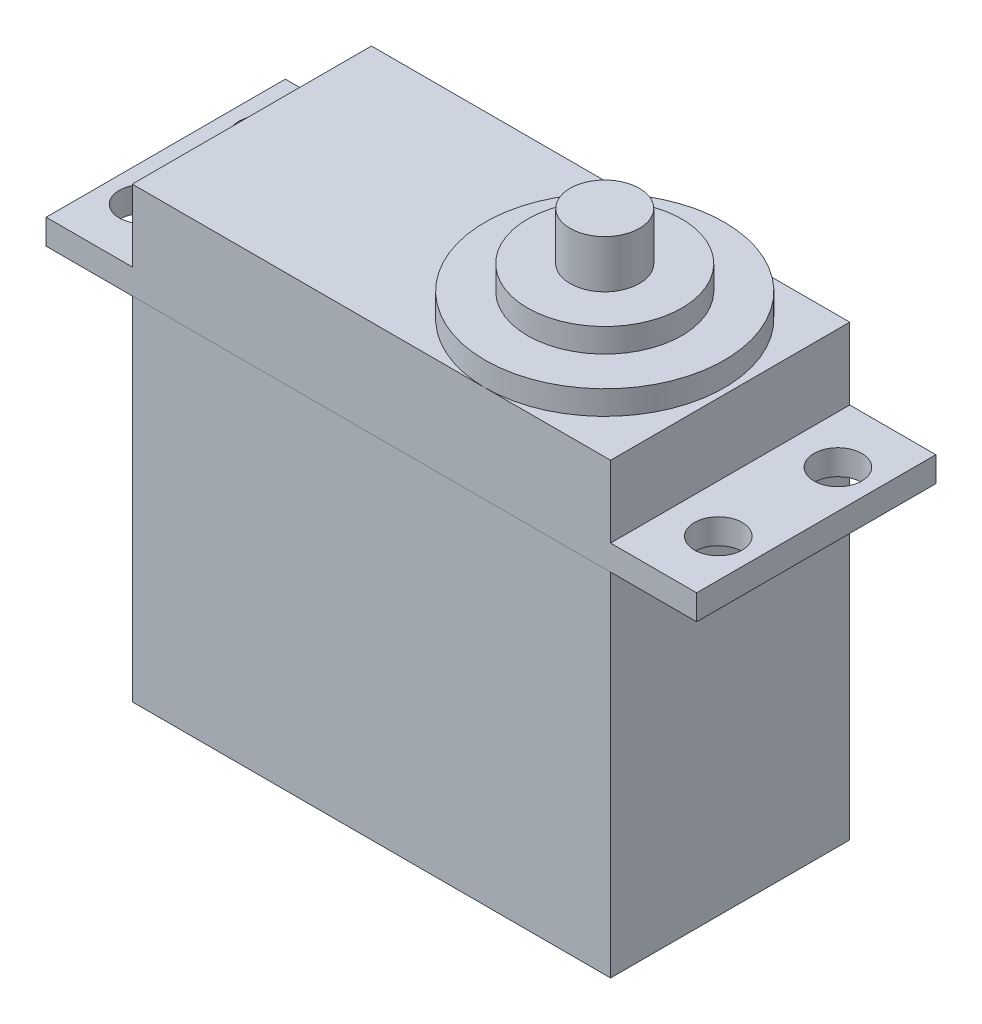
ISO-10303-21;
HEADER;
FILE_DESCRIPTION(('STEP AP214'),'2;1');
FILE_NAME('part.step','',(''),(''),'','','');
FILE_SCHEMA(('AUTOMOTIVE_DESIGN { 1 0 10303 214 1 1 1 1 }'));
ENDSEC;
DATA;
#1=APPLICATION_CONTEXT('core data for automotive mechanical design processes');
#2=APPLICATION_PROTOCOL_DEFINITION('international standard','automotive_design',2000,#1);
#3=PRODUCT_CONTEXT('',#1,'mechanical');
#4=PRODUCT('Part','Part','',(#3));
#5=PRODUCT_RELATED_PRODUCT_CATEGORY('part','',(#4));
#6=PRODUCT_DEFINITION_FORMATION('','',#4);
#7=PRODUCT_DEFINITION_CONTEXT('part definition',#1,'design');
#8=PRODUCT_DEFINITION('design','',#6,#7);
#9=PRODUCT_DEFINITION_SHAPE('','',#8);
#10=(LENGTH_UNIT() NAMED_UNIT(*) SI_UNIT(.MILLI.,.METRE.));
#11=(NAMED_UNIT(*) PLANE_ANGLE_UNIT() SI_UNIT($,.RADIAN.));
#12=(NAMED_UNIT(*) SI_UNIT($,.STERADIAN.) SOLID_ANGLE_UNIT());
#13=UNCERTAINTY_MEASURE_WITH_UNIT(LENGTH_MEASURE(1.E-05),#10,'distance_accuracy_value','');
#14=(GEOMETRIC_REPRESENTATION_CONTEXT(3) GLOBAL_UNCERTAINTY_ASSIGNED_CONTEXT((#13)) GLOBAL_UNIT_ASSIGNED_CONTEXT((#10,
#11,#12)) REPRESENTATION_CONTEXT('',''));
#15=CARTESIAN_POINT('',(0.,0.,0.));
#16=DIRECTION('',(0.,0.,1.));
#17=DIRECTION('',(1.,0.,0.));
#18=AXIS2_PLACEMENT_3D('',#15,#16,#17);
#19=CARTESIAN_POINT('',(0.,37.5,0.));
#20=DIRECTION('',(0.,1.,0.));
#21=DIRECTION('',(0.,0.,1.));
#22=AXIS2_PLACEMENT_3D('',#19,#20,#21);
#23=PLANE('',#22);
#24=CARTESIAN_POINT('',(29.5103682892478,37.5,10.001656383287));
#25=DIRECTION('',(0.,1.,0.));
#26=DIRECTION('',(0.,0.,1.));
#27=AXIS2_PLACEMENT_3D('',#24,#25,#26);
#28=CIRCLE('',#27,10.001656383287);
#29=CARTESIAN_POINT('',(29.5103682892478,37.5,20.0033127665741));
#30=VERTEX_POINT('',#29);
#31=CARTESIAN_POINT('',(29.5103682892478,37.5,0.));
#32=VERTEX_POINT('',#31);
#33=EDGE_CURVE('E49',#30,#32,#28,.T.);
#34=ORIENTED_EDGE('',*,*,#33,.F.);
#35=DIRECTION('',(1.,0.,0.));
#36=VECTOR('',#35,1.);
#37=CARTESIAN_POINT('',(0.,37.5,20.0033127665741));
#38=LINE('',#37,#36);
#39=CARTESIAN_POINT('',(40.0016265814225,37.5,20.0033127665741));
#40=VERTEX_POINT('',#39);
#41=EDGE_CURVE('E141',#30,#40,#38,.T.);
#42=ORIENTED_EDGE('',*,*,#41,.T.);
#43=DIRECTION('',(-8.13156018770147E-05,0.,-0.999999996693887));
#44=VECTOR('',#43,1.);
#45=CARTESIAN_POINT('',(40.0016265814225,37.5,20.0033127665741));
#46=LINE('',#45,#44);
#47=CARTESIAN_POINT('',(40.,37.5,0.));
#48=VERTEX_POINT('',#47);
#49=EDGE_CURVE('E140',#40,#48,#46,.T.);
#50=ORIENTED_EDGE('',*,*,#49,.T.);
#51=DIRECTION('',(-1.,0.,0.));
#52=VECTOR('',#51,1.);
#53=CARTESIAN_POINT('',(40.,37.5,0.));
#54=LINE('',#53,#52);
#55=EDGE_CURVE('E153',#48,#32,#54,.T.);
#56=ORIENTED_EDGE('',*,*,#55,.T.);
#57=EDGE_LOOP('',(#34,#42,#50,#56));
#58=FACE_BOUND('',#57,.T.);
#59=ADVANCED_FACE('F38',(#58),#23,.T.);
#60=CARTESIAN_POINT('',(0.,31.5,0.));
#61=DIRECTION('',(0.,1.,0.));
#62=DIRECTION('',(0.,0.,1.));
#63=AXIS2_PLACEMENT_3D('',#60,#61,#62);
#64=PLANE('',#63);
#65=DIRECTION('',(-8.13156018770147E-05,0.,-0.999999996693887));
#66=VECTOR('',#65,1.);
#67=CARTESIAN_POINT('',(40.0016265814225,31.5,20.0033127665741));
#68=LINE('',#67,#66);
#69=CARTESIAN_POINT('',(40.0016265814225,31.5,20.0033127665741));
#70=VERTEX_POINT('',#69);
#71=CARTESIAN_POINT('',(40.,31.5,0.));
#72=VERTEX_POINT('',#71);
#73=EDGE_CURVE('E62',#70,#72,#68,.T.);
#74=ORIENTED_EDGE('',*,*,#73,.F.);
#75=DIRECTION('',(1.,0.,0.));
#76=VECTOR('',#75,1.);
#77=CARTESIAN_POINT('',(-7.19999999999999,31.5,20.0033127665741));
#78=LINE('',#77,#76);
#79=CARTESIAN_POINT('',(47.2,31.5,20.0033127665741));
#80=VERTEX_POINT('',#79);
#81=EDGE_CURVE('E322',#70,#80,#78,.T.);
#82=ORIENTED_EDGE('',*,*,#81,.T.);
#83=DIRECTION('',(0.,0.,-1.));
#84=VECTOR('',#83,1.);
#85=CARTESIAN_POINT('',(47.2,31.5,20.0033127665741));
#86=LINE('',#85,#84);
#87=CARTESIAN_POINT('',(47.2,31.5,0.));
#88=VERTEX_POINT('',#87);
#89=EDGE_CURVE('E295',#80,#88,#86,.T.);
#90=ORIENTED_EDGE('',*,*,#89,.T.);
#91=DIRECTION('',(-1.,0.,0.));
#92=VECTOR('',#91,1.);
#93=CARTESIAN_POINT('',(20.,31.5,0.));
#94=LINE('',#93,#92);
#95=EDGE_CURVE('E317',#88,#72,#94,.T.);
#96=ORIENTED_EDGE('',*,*,#95,.T.);
#97=EDGE_LOOP('',(#74,#82,#90,#96));
#98=FACE_BOUND('',#97,.T.);
#99=CARTESIAN_POINT('',(44.0104813759934,31.5,5.00082819164352));
#100=DIRECTION('',(0.,1.,0.));
#101=DIRECTION('',(0.,0.,1.));
#102=AXIS2_PLACEMENT_3D('',#99,#100,#101);
#103=CIRCLE('',#102,2.);
#104=CARTESIAN_POINT('',(44.0104813759934,31.5,7.00082819164352));
#105=VERTEX_POINT('',#104);
#106=EDGE_CURVE('E364',#105,#105,#103,.T.);
#107=ORIENTED_EDGE('',*,*,#106,.F.);
#108=EDGE_LOOP('',(#107));
#109=FACE_BOUND('',#108,.T.);
#110=CARTESIAN_POINT('',(44.0104813759934,31.5,15.0024845749306));
#111=DIRECTION('',(0.,1.,0.));
#112=DIRECTION('',(0.,0.,1.));
#113=AXIS2_PLACEMENT_3D('',#110,#111,#112);
#114=CIRCLE('',#113,2.);
#115=CARTESIAN_POINT('',(44.0104813759934,31.5,17.0024845749306));
#116=VERTEX_POINT('',#115);
#117=EDGE_CURVE('E365',#116,#116,#114,.T.);
#118=ORIENTED_EDGE('',*,*,#117,.F.);
#119=EDGE_LOOP('',(#118));
#120=FACE_BOUND('',#119,.T.);
#121=ADVANCED_FACE('F173',(#98,#109,#120),#64,.T.);
#122=CARTESIAN_POINT('',(0.,29.4,0.));
#123=DIRECTION('',(1.,0.,0.));
#124=DIRECTION('',(0.,0.,-1.));
#125=AXIS2_PLACEMENT_3D('',#122,#123,#124);
#126=PLANE('',#125);
#127=DIRECTION('',(0.,0.,1.));
#128=VECTOR('',#127,1.);
#129=CARTESIAN_POINT('',(0.,0.,0.));
#130=LINE('',#129,#128);
#131=CARTESIAN_POINT('',(0.,0.,0.));
#132=VERTEX_POINT('',#131);
#133=CARTESIAN_POINT('',(0.,0.,20.));
#134=VERTEX_POINT('',#133);
#135=EDGE_CURVE('E247',#132,#134,#130,.T.);
#136=ORIENTED_EDGE('',*,*,#135,.T.);
#137=DIRECTION('',(0.,-1.,0.));
#138=VECTOR('',#137,1.);
#139=CARTESIAN_POINT('',(0.,29.4,20.));
#140=LINE('',#139,#138);
#141=CARTESIAN_POINT('',(0.,29.4,20.));
#142=VERTEX_POINT('',#141);
#143=EDGE_CURVE('E47',#142,#134,#140,.T.);
#144=ORIENTED_EDGE('',*,*,#143,.F.);
#145=DIRECTION('',(0.,0.,1.));
#146=VECTOR('',#145,1.);
#147=CARTESIAN_POINT('',(0.,29.4,0.));
#148=LINE('',#147,#146);
#149=CARTESIAN_POINT('',(0.,29.4,0.));
#150=VERTEX_POINT('',#149);
#151=EDGE_CURVE('E258',#150,#142,#148,.T.);
#152=ORIENTED_EDGE('',*,*,#151,.F.);
#153=DIRECTION('',(0.,-1.,0.));
#154=VECTOR('',#153,1.);
#155=CARTESIAN_POINT('',(0.,29.4,0.));
#156=LINE('',#155,#154);
#157=EDGE_CURVE('E264',#150,#132,#156,.T.);
#158=ORIENTED_EDGE('',*,*,#157,.T.);
#159=EDGE_LOOP('',(#136,#144,#152,#158));
#160=FACE_BOUND('',#159,.T.);
#161=ADVANCED_FACE('F40',(#160),#126,.F.);
#162=CARTESIAN_POINT('',(0.,29.4,20.));
#163=DIRECTION('',(0.,0.,-1.));
#164=DIRECTION('',(-1.,0.,0.));
#165=AXIS2_PLACEMENT_3D('',#162,#163,#164);
#166=PLANE('',#165);
#167=DIRECTION('',(1.,0.,0.));
#168=VECTOR('',#167,1.);
#169=CARTESIAN_POINT('',(0.,0.,20.));
#170=LINE('',#169,#168);
#171=CARTESIAN_POINT('',(40.,0.,20.));
#172=VERTEX_POINT('',#171);
#173=EDGE_CURVE('E238',#134,#172,#170,.T.);
#174=ORIENTED_EDGE('',*,*,#173,.T.);
#175=DIRECTION('',(0.,-1.,0.));
#176=VECTOR('',#175,1.);
#177=CARTESIAN_POINT('',(40.,29.4,20.));
#178=LINE('',#177,#176);
#179=CARTESIAN_POINT('',(40.,29.4,20.));
#180=VERTEX_POINT('',#179);
#181=EDGE_CURVE('E240',#180,#172,#178,.T.);
#182=ORIENTED_EDGE('',*,*,#181,.F.);
#183=DIRECTION('',(1.,0.,0.));
#184=VECTOR('',#183,1.);
#185=CARTESIAN_POINT('',(0.,29.4,20.));
#186=LINE('',#185,#184);
#187=EDGE_CURVE('E269',#142,#180,#186,.T.);
#188=ORIENTED_EDGE('',*,*,#187,.F.);
#189=ORIENTED_EDGE('',*,*,#143,.T.);
#190=EDGE_LOOP('',(#174,#182,#188,#189));
#191=FACE_BOUND('',#190,.T.);
#192=ADVANCED_FACE('F229',(#191),#166,.F.);
#193=CARTESIAN_POINT('',(40.,29.4,0.));
#194=DIRECTION('',(-1.,0.,0.));
#195=DIRECTION('',(0.,0.,1.));
#196=AXIS2_PLACEMENT_3D('',#193,#194,#195);
#197=PLANE('',#196);
#198=DIRECTION('',(0.,0.,-1.));
#199=VECTOR('',#198,1.);
#200=CARTESIAN_POINT('',(40.,0.,0.));
#201=LINE('',#200,#199);
#202=CARTESIAN_POINT('',(40.,0.,0.));
#203=VERTEX_POINT('',#202);
#204=EDGE_CURVE('E246',#172,#203,#201,.T.);
#205=ORIENTED_EDGE('',*,*,#204,.T.);
#206=DIRECTION('',(0.,-1.,0.));
#207=VECTOR('',#206,1.);
#208=CARTESIAN_POINT('',(40.,29.4,0.));
#209=LINE('',#208,#207);
#210=CARTESIAN_POINT('',(40.,29.4,0.));
#211=VERTEX_POINT('',#210);
#212=EDGE_CURVE('E253',#211,#203,#209,.T.);
#213=ORIENTED_EDGE('',*,*,#212,.F.);
#214=DIRECTION('',(0.,0.,-1.));
#215=VECTOR('',#214,1.);
#216=CARTESIAN_POINT('',(40.,29.4,0.));
#217=LINE('',#216,#215);
#218=EDGE_CURVE('E251',#180,#211,#217,.T.);
#219=ORIENTED_EDGE('',*,*,#218,.F.);
#220=ORIENTED_EDGE('',*,*,#181,.T.);
#221=EDGE_LOOP('',(#205,#213,#219,#220));
#222=FACE_BOUND('',#221,.T.);
#223=ADVANCED_FACE('F226',(#222),#197,.F.);
#224=CARTESIAN_POINT('',(0.,29.4,0.));
#225=DIRECTION('',(0.,0.,1.));
#226=DIRECTION('',(1.,0.,0.));
#227=AXIS2_PLACEMENT_3D('',#224,#225,#226);
#228=PLANE('',#227);
#229=DIRECTION('',(-1.,0.,0.));
#230=VECTOR('',#229,1.);
#231=CARTESIAN_POINT('',(0.,0.,0.));
#232=LINE('',#231,#230);
#233=EDGE_CURVE('E256',#203,#132,#232,.T.);
#234=ORIENTED_EDGE('',*,*,#233,.T.);
#235=ORIENTED_EDGE('',*,*,#157,.F.);
#236=DIRECTION('',(-1.,0.,0.));
#237=VECTOR('',#236,1.);
#238=CARTESIAN_POINT('',(20.,29.4,0.));
#239=LINE('',#238,#237);
#240=CARTESIAN_POINT('',(-7.19999999999999,29.4,0.));
#241=VERTEX_POINT('',#240);
#242=EDGE_CURVE('E291',#150,#241,#239,.T.);
#243=ORIENTED_EDGE('',*,*,#242,.T.);
#244=DIRECTION('',(0.,-1.,0.));
#245=VECTOR('',#244,1.);
#246=CARTESIAN_POINT('',(-7.19999999999999,31.5,0.));
#247=LINE('',#246,#245);
#248=CARTESIAN_POINT('',(-7.19999999999999,31.5,0.));
#249=VERTEX_POINT('',#248);
#250=EDGE_CURVE('E274',#249,#241,#247,.T.);
#251=ORIENTED_EDGE('',*,*,#250,.F.);
#252=CARTESIAN_POINT('',(0.,31.5,0.));
#253=VERTEX_POINT('',#252);
#254=EDGE_CURVE('E304',#253,#249,#94,.T.);
#255=ORIENTED_EDGE('',*,*,#254,.F.);
#256=DIRECTION('',(0.,-1.,0.));
#257=VECTOR('',#256,1.);
#258=CARTESIAN_POINT('',(0.,37.5,0.));
#259=LINE('',#258,#257);
#260=CARTESIAN_POINT('',(0.,37.5,0.));
#261=VERTEX_POINT('',#260);
#262=EDGE_CURVE('E344',#261,#253,#259,.T.);
#263=ORIENTED_EDGE('',*,*,#262,.F.);
#264=EDGE_CURVE('E352',#32,#261,#54,.T.);
#265=ORIENTED_EDGE('',*,*,#264,.F.);
#266=ORIENTED_EDGE('',*,*,#55,.F.);
#267=DIRECTION('',(0.,-1.,0.));
#268=VECTOR('',#267,1.);
#269=CARTESIAN_POINT('',(40.,37.5,0.));
#270=LINE('',#269,#268);
#271=EDGE_CURVE('E319',#48,#72,#270,.T.);
#272=ORIENTED_EDGE('',*,*,#271,.T.);
#273=ORIENTED_EDGE('',*,*,#95,.F.);
#274=DIRECTION('',(0.,-1.,0.));
#275=VECTOR('',#274,1.);
#276=CARTESIAN_POINT('',(47.2,31.5,0.));
#277=LINE('',#276,#275);
#278=CARTESIAN_POINT('',(47.2,29.4,0.));
#279=VERTEX_POINT('',#278);
#280=EDGE_CURVE('E305',#88,#279,#277,.T.);
#281=ORIENTED_EDGE('',*,*,#280,.T.);
#282=EDGE_CURVE('E287',#279,#211,#239,.T.);
#283=ORIENTED_EDGE('',*,*,#282,.T.);
#284=ORIENTED_EDGE('',*,*,#212,.T.);
#285=EDGE_LOOP('',(#234,#235,#243,#251,#255,#263,#265,#266,#272,#273,#281,#283,#284));
#286=FACE_BOUND('',#285,.T.);
#287=ADVANCED_FACE('F222',(#286),#228,.F.);
#288=CARTESIAN_POINT('',(0.,0.,0.));
#289=DIRECTION('',(0.,1.,0.));
#290=DIRECTION('',(0.,0.,1.));
#291=AXIS2_PLACEMENT_3D('',#288,#289,#290);
#292=PLANE('',#291);
#293=ORIENTED_EDGE('',*,*,#135,.F.);
#294=ORIENTED_EDGE('',*,*,#233,.F.);
#295=ORIENTED_EDGE('',*,*,#204,.F.);
#296=ORIENTED_EDGE('',*,*,#173,.F.);
#297=EDGE_LOOP('',(#293,#294,#295,#296));
#298=FACE_BOUND('',#297,.T.);
#299=ADVANCED_FACE('F210',(#298),#292,.F.);
#300=CARTESIAN_POINT('',(0.,29.4,0.));
#301=DIRECTION('',(0.,1.,0.));
#302=DIRECTION('',(0.,0.,1.));
#303=AXIS2_PLACEMENT_3D('',#300,#301,#302);
#304=PLANE('',#303);
#305=CARTESIAN_POINT('',(44.0104813759934,29.4,15.0024845749306));
#306=DIRECTION('',(0.,1.,0.));
#307=DIRECTION('',(0.,0.,1.));
#308=AXIS2_PLACEMENT_3D('',#305,#306,#307);
#309=CIRCLE('',#308,2.);
#310=CARTESIAN_POINT('',(44.0104813759934,29.4,17.0024845749306));
#311=VERTEX_POINT('',#310);
#312=EDGE_CURVE('E361',#311,#311,#309,.T.);
#313=ORIENTED_EDGE('',*,*,#312,.T.);
#314=EDGE_LOOP('',(#313));
#315=FACE_BOUND('',#314,.T.);
#316=CARTESIAN_POINT('',(44.0104813759934,29.4,5.00082819164352));
#317=DIRECTION('',(0.,1.,0.));
#318=DIRECTION('',(0.,0.,1.));
#319=AXIS2_PLACEMENT_3D('',#316,#317,#318);
#320=CIRCLE('',#319,2.);
#321=CARTESIAN_POINT('',(44.0104813759934,29.4,7.00082819164352));
#322=VERTEX_POINT('',#321);
#323=EDGE_CURVE('E368',#322,#322,#320,.T.);
#324=ORIENTED_EDGE('',*,*,#323,.T.);
#325=EDGE_LOOP('',(#324));
#326=FACE_BOUND('',#325,.T.);
#327=CARTESIAN_POINT('',(-4.09577615885656,29.4,15.0024845749306));
#328=DIRECTION('',(0.,1.,0.));
#329=DIRECTION('',(0.,0.,1.));
#330=AXIS2_PLACEMENT_3D('',#327,#328,#329);
#331=CIRCLE('',#330,2.);
#332=CARTESIAN_POINT('',(-4.09577615885656,29.4,17.0024845749306));
#333=VERTEX_POINT('',#332);
#334=EDGE_CURVE('E374',#333,#333,#331,.T.);
#335=ORIENTED_EDGE('',*,*,#334,.T.);
#336=EDGE_LOOP('',(#335));
#337=FACE_BOUND('',#336,.T.);
#338=CARTESIAN_POINT('',(-4.09577615885656,29.4,5.00082819164352));
#339=DIRECTION('',(0.,1.,0.));
#340=DIRECTION('',(0.,0.,1.));
#341=AXIS2_PLACEMENT_3D('',#338,#339,#340);
#342=CIRCLE('',#341,2.);
#343=CARTESIAN_POINT('',(-4.09577615885656,29.4,7.00082819164352));
#344=VERTEX_POINT('',#343);
#345=EDGE_CURVE('E378',#344,#344,#342,.T.);
#346=ORIENTED_EDGE('',*,*,#345,.T.);
#347=EDGE_LOOP('',(#346));
#348=FACE_BOUND('',#347,.T.);
#349=ORIENTED_EDGE('',*,*,#242,.F.);
#350=ORIENTED_EDGE('',*,*,#151,.T.);
#351=ORIENTED_EDGE('',*,*,#187,.T.);
#352=ORIENTED_EDGE('',*,*,#218,.T.);
#353=ORIENTED_EDGE('',*,*,#282,.F.);
#354=DIRECTION('',(0.,0.,-1.));
#355=VECTOR('',#354,1.);
#356=CARTESIAN_POINT('',(47.2,29.4,20.0033127665741));
#357=LINE('',#356,#355);
#358=CARTESIAN_POINT('',(47.2,29.4,20.0033127665741));
#359=VERTEX_POINT('',#358);
#360=EDGE_CURVE('E301',#359,#279,#357,.T.);
#361=ORIENTED_EDGE('',*,*,#360,.F.);
#362=DIRECTION('',(1.,0.,0.));
#363=VECTOR('',#362,1.);
#364=CARTESIAN_POINT('',(-7.19999999999999,29.4,20.0033127665741));
#365=LINE('',#364,#363);
#366=CARTESIAN_POINT('',(-7.19999999999999,29.4,20.0033127665741));
#367=VERTEX_POINT('',#366);
#368=EDGE_CURVE('E299',#367,#359,#365,.T.);
#369=ORIENTED_EDGE('',*,*,#368,.F.);
#370=DIRECTION('',(0.,0.,1.));
#371=VECTOR('',#370,1.);
#372=CARTESIAN_POINT('',(-7.19999999999999,29.4,0.));
#373=LINE('',#372,#371);
#374=EDGE_CURVE('E290',#241,#367,#373,.T.);
#375=ORIENTED_EDGE('',*,*,#374,.F.);
#376=EDGE_LOOP('',(#349,#350,#351,#352,#353,#361,#369,#375));
#377=FACE_BOUND('',#376,.T.);
#378=ADVANCED_FACE('F206',(#315,#326,#337,#348,#377),#304,.F.);
#379=CARTESIAN_POINT('',(-7.19999999999999,31.5,0.));
#380=DIRECTION('',(1.,0.,0.));
#381=DIRECTION('',(0.,0.,-1.));
#382=AXIS2_PLACEMENT_3D('',#379,#380,#381);
#383=PLANE('',#382);
#384=ORIENTED_EDGE('',*,*,#374,.T.);
#385=DIRECTION('',(0.,-1.,0.));
#386=VECTOR('',#385,1.);
#387=CARTESIAN_POINT('',(-7.19999999999999,31.5,20.0033127665741));
#388=LINE('',#387,#386);
#389=CARTESIAN_POINT('',(-7.19999999999999,31.5,20.0033127665741));
#390=VERTEX_POINT('',#389);
#391=EDGE_CURVE('E277',#390,#367,#388,.T.);
#392=ORIENTED_EDGE('',*,*,#391,.F.);
#393=DIRECTION('',(0.,0.,1.));
#394=VECTOR('',#393,1.);
#395=CARTESIAN_POINT('',(-7.19999999999999,31.5,0.));
#396=LINE('',#395,#394);
#397=EDGE_CURVE('E320',#249,#390,#396,.T.);
#398=ORIENTED_EDGE('',*,*,#397,.F.);
#399=ORIENTED_EDGE('',*,*,#250,.T.);
#400=EDGE_LOOP('',(#384,#392,#398,#399));
#401=FACE_BOUND('',#400,.T.);
#402=ADVANCED_FACE('F209',(#401),#383,.F.);
#403=CARTESIAN_POINT('',(-7.19999999999999,31.5,20.0033127665741));
#404=DIRECTION('',(0.,0.,-1.));
#405=DIRECTION('',(-1.,0.,0.));
#406=AXIS2_PLACEMENT_3D('',#403,#404,#405);
#407=PLANE('',#406);
#408=ORIENTED_EDGE('',*,*,#368,.T.);
#409=DIRECTION('',(0.,-1.,0.));
#410=VECTOR('',#409,1.);
#411=CARTESIAN_POINT('',(47.2,31.5,20.0033127665741));
#412=LINE('',#411,#410);
#413=EDGE_CURVE('E283',#80,#359,#412,.T.);
#414=ORIENTED_EDGE('',*,*,#413,.F.);
#415=ORIENTED_EDGE('',*,*,#81,.F.);
#416=DIRECTION('',(0.,-1.,0.));
#417=VECTOR('',#416,1.);
#418=CARTESIAN_POINT('',(40.0016265814225,37.5,20.0033127665741));
#419=LINE('',#418,#417);
#420=EDGE_CURVE('E147',#40,#70,#419,.T.);
#421=ORIENTED_EDGE('',*,*,#420,.F.);
#422=ORIENTED_EDGE('',*,*,#41,.F.);
#423=CARTESIAN_POINT('',(0.,37.5,20.0033127665741));
#424=VERTEX_POINT('',#423);
#425=EDGE_CURVE('E132',#424,#30,#38,.T.);
#426=ORIENTED_EDGE('',*,*,#425,.F.);
#427=DIRECTION('',(0.,-1.,0.));
#428=VECTOR('',#427,1.);
#429=CARTESIAN_POINT('',(0.,37.5,20.0033127665741));
#430=LINE('',#429,#428);
#431=CARTESIAN_POINT('',(0.,31.5,20.0033127665741));
#432=VERTEX_POINT('',#431);
#433=EDGE_CURVE('E343',#424,#432,#430,.T.);
#434=ORIENTED_EDGE('',*,*,#433,.T.);
#435=EDGE_CURVE('E339',#390,#432,#78,.T.);
#436=ORIENTED_EDGE('',*,*,#435,.F.);
#437=ORIENTED_EDGE('',*,*,#391,.T.);
#438=EDGE_LOOP('',(#408,#414,#415,#421,#422,#426,#434,#436,#437));
#439=FACE_BOUND('',#438,.T.);
#440=ADVANCED_FACE('F145',(#439),#407,.F.);
#441=CARTESIAN_POINT('',(47.2,31.5,20.0033127665741));
#442=DIRECTION('',(-1.,0.,0.));
#443=DIRECTION('',(0.,0.,1.));
#444=AXIS2_PLACEMENT_3D('',#441,#442,#443);
#445=PLANE('',#444);
#446=ORIENTED_EDGE('',*,*,#360,.T.);
#447=ORIENTED_EDGE('',*,*,#280,.F.);
#448=ORIENTED_EDGE('',*,*,#89,.F.);
#449=ORIENTED_EDGE('',*,*,#413,.T.);
#450=EDGE_LOOP('',(#446,#447,#448,#449));
#451=FACE_BOUND('',#450,.T.);
#452=ADVANCED_FACE('F204',(#451),#445,.F.);
#453=DIRECTION('',(0.,0.,1.));
#454=VECTOR('',#453,1.);
#455=CARTESIAN_POINT('',(0.,31.5,0.));
#456=LINE('',#455,#454);
#457=EDGE_CURVE('E353',#253,#432,#456,.T.);
#458=ORIENTED_EDGE('',*,*,#457,.F.);
#459=ORIENTED_EDGE('',*,*,#254,.T.);
#460=ORIENTED_EDGE('',*,*,#397,.T.);
#461=ORIENTED_EDGE('',*,*,#435,.T.);
#462=EDGE_LOOP('',(#458,#459,#460,#461));
#463=FACE_BOUND('',#462,.T.);
#464=CARTESIAN_POINT('',(-4.09577615885656,31.5,15.0024845749306));
#465=DIRECTION('',(0.,1.,0.));
#466=DIRECTION('',(0.,0.,1.));
#467=AXIS2_PLACEMENT_3D('',#464,#465,#466);
#468=CIRCLE('',#467,2.);
#469=CARTESIAN_POINT('',(-4.09577615885656,31.5,17.0024845749306));
#470=VERTEX_POINT('',#469);
#471=EDGE_CURVE('E371',#470,#470,#468,.T.);
#472=ORIENTED_EDGE('',*,*,#471,.F.);
#473=EDGE_LOOP('',(#472));
#474=FACE_BOUND('',#473,.T.);
#475=CARTESIAN_POINT('',(-4.09577615885656,31.5,5.00082819164352));
#476=DIRECTION('',(0.,1.,0.));
#477=DIRECTION('',(0.,0.,1.));
#478=AXIS2_PLACEMENT_3D('',#475,#476,#477);
#479=CIRCLE('',#478,2.);
#480=CARTESIAN_POINT('',(-4.09577615885656,31.5,7.00082819164352));
#481=VERTEX_POINT('',#480);
#482=EDGE_CURVE('E332',#481,#481,#479,.T.);
#483=ORIENTED_EDGE('',*,*,#482,.F.);
#484=EDGE_LOOP('',(#483));
#485=FACE_BOUND('',#484,.T.);
#486=ADVANCED_FACE('F178',(#463,#474,#485),#64,.T.);
#487=CARTESIAN_POINT('',(-4.09577615885656,29.4,5.00082819164352));
#488=DIRECTION('',(0.,1.,0.));
#489=DIRECTION('',(0.,0.,1.));
#490=AXIS2_PLACEMENT_3D('',#487,#488,#489);
#491=CYLINDRICAL_SURFACE('',#490,2.);
#492=ORIENTED_EDGE('',*,*,#345,.F.);
#493=EDGE_LOOP('',(#492));
#494=FACE_BOUND('',#493,.T.);
#495=ORIENTED_EDGE('',*,*,#482,.T.);
#496=EDGE_LOOP('',(#495));
#497=FACE_BOUND('',#496,.T.);
#498=ADVANCED_FACE('F198',(#494,#497),#491,.F.);
#499=CARTESIAN_POINT('',(-4.09577615885656,29.4,15.0024845749306));
#500=DIRECTION('',(0.,1.,0.));
#501=DIRECTION('',(0.,0.,1.));
#502=AXIS2_PLACEMENT_3D('',#499,#500,#501);
#503=CYLINDRICAL_SURFACE('',#502,2.);
#504=ORIENTED_EDGE('',*,*,#334,.F.);
#505=EDGE_LOOP('',(#504));
#506=FACE_BOUND('',#505,.T.);
#507=ORIENTED_EDGE('',*,*,#471,.T.);
#508=EDGE_LOOP('',(#507));
#509=FACE_BOUND('',#508,.T.);
#510=ADVANCED_FACE('F194',(#506,#509),#503,.F.);
#511=CARTESIAN_POINT('',(44.0104813759934,29.4,5.00082819164352));
#512=DIRECTION('',(0.,1.,0.));
#513=DIRECTION('',(0.,0.,1.));
#514=AXIS2_PLACEMENT_3D('',#511,#512,#513);
#515=CYLINDRICAL_SURFACE('',#514,2.);
#516=ORIENTED_EDGE('',*,*,#323,.F.);
#517=EDGE_LOOP('',(#516));
#518=FACE_BOUND('',#517,.T.);
#519=ORIENTED_EDGE('',*,*,#106,.T.);
#520=EDGE_LOOP('',(#519));
#521=FACE_BOUND('',#520,.T.);
#522=ADVANCED_FACE('F190',(#518,#521),#515,.F.);
#523=CARTESIAN_POINT('',(44.0104813759934,29.4,15.0024845749306));
#524=DIRECTION('',(0.,1.,0.));
#525=DIRECTION('',(0.,0.,1.));
#526=AXIS2_PLACEMENT_3D('',#523,#524,#525);
#527=CYLINDRICAL_SURFACE('',#526,2.);
#528=ORIENTED_EDGE('',*,*,#312,.F.);
#529=EDGE_LOOP('',(#528));
#530=FACE_BOUND('',#529,.T.);
#531=ORIENTED_EDGE('',*,*,#117,.T.);
#532=EDGE_LOOP('',(#531));
#533=FACE_BOUND('',#532,.T.);
#534=ADVANCED_FACE('F186',(#530,#533),#527,.F.);
#535=CARTESIAN_POINT('',(0.,37.5,0.));
#536=DIRECTION('',(1.,0.,0.));
#537=DIRECTION('',(0.,0.,-1.));
#538=AXIS2_PLACEMENT_3D('',#535,#536,#537);
#539=PLANE('',#538);
#540=ORIENTED_EDGE('',*,*,#457,.T.);
#541=ORIENTED_EDGE('',*,*,#433,.F.);
#542=DIRECTION('',(0.,0.,1.));
#543=VECTOR('',#542,1.);
#544=CARTESIAN_POINT('',(0.,37.5,0.));
#545=LINE('',#544,#543);
#546=EDGE_CURVE('E136',#261,#424,#545,.T.);
#547=ORIENTED_EDGE('',*,*,#546,.F.);
#548=ORIENTED_EDGE('',*,*,#262,.T.);
#549=EDGE_LOOP('',(#540,#541,#547,#548));
#550=FACE_BOUND('',#549,.T.);
#551=ADVANCED_FACE('F182',(#550),#539,.F.);
#552=CARTESIAN_POINT('',(40.0016265814225,37.5,20.0033127665741));
#553=DIRECTION('',(-0.999999996693886,0.,8.13156018770147E-05));
#554=DIRECTION('',(8.13156018770147E-05,0.,0.999999996693887));
#555=AXIS2_PLACEMENT_3D('',#552,#553,#554);
#556=PLANE('',#555);
#557=ORIENTED_EDGE('',*,*,#73,.T.);
#558=ORIENTED_EDGE('',*,*,#271,.F.);
#559=ORIENTED_EDGE('',*,*,#49,.F.);
#560=ORIENTED_EDGE('',*,*,#420,.T.);
#561=EDGE_LOOP('',(#557,#558,#559,#560));
#562=FACE_BOUND('',#561,.T.);
#563=ADVANCED_FACE('F169',(#562),#556,.F.);
#564=EDGE_CURVE('E11',#32,#30,#28,.T.);
#565=ORIENTED_EDGE('',*,*,#564,.F.);
#566=ORIENTED_EDGE('',*,*,#264,.T.);
#567=ORIENTED_EDGE('',*,*,#546,.T.);
#568=ORIENTED_EDGE('',*,*,#425,.T.);
#569=EDGE_LOOP('',(#565,#566,#567,#568));
#570=FACE_BOUND('',#569,.T.);
#571=ADVANCED_FACE('F134',(#570),#23,.T.);
#572=CARTESIAN_POINT('',(29.5103682892478,39.5,10.001656383287));
#573=DIRECTION('',(0.,-1.,0.));
#574=DIRECTION('',(0.,0.,-1.));
#575=AXIS2_PLACEMENT_3D('',#572,#573,#574);
#576=CYLINDRICAL_SURFACE('',#575,10.001656383287);
#577=CARTESIAN_POINT('',(29.5103682892478,39.5,10.001656383287));
#578=DIRECTION('',(0.,1.,0.));
#579=DIRECTION('',(0.,0.,1.));
#580=AXIS2_PLACEMENT_3D('',#577,#578,#579);
#581=CIRCLE('',#580,10.001656383287);
#582=CARTESIAN_POINT('',(29.5103682892478,39.5,20.0033127665741));
#583=VERTEX_POINT('',#582);
#584=EDGE_CURVE('E155',#583,#583,#581,.T.);
#585=ORIENTED_EDGE('',*,*,#584,.F.);
#586=EDGE_LOOP('',(#585));
#587=FACE_BOUND('',#586,.T.);
#588=ORIENTED_EDGE('',*,*,#33,.T.);
#589=ORIENTED_EDGE('',*,*,#564,.T.);
#590=EDGE_LOOP('',(#588,#589));
#591=FACE_BOUND('',#590,.T.);
#592=ADVANCED_FACE('F157',(#587,#591),#576,.T.);
#593=CARTESIAN_POINT('',(0.,39.5,0.));
#594=DIRECTION('',(0.,1.,0.));
#595=DIRECTION('',(0.,0.,1.));
#596=AXIS2_PLACEMENT_3D('',#593,#594,#595);
#597=PLANE('',#596);
#598=CARTESIAN_POINT('',(29.5103682892478,39.5,10.001656383287));
#599=DIRECTION('',(0.,1.,0.));
#600=DIRECTION('',(0.,0.,1.));
#601=AXIS2_PLACEMENT_3D('',#598,#599,#600);
#602=CIRCLE('',#601,6.45);
#603=CARTESIAN_POINT('',(29.5103682892478,39.5,16.451656383287));
#604=VERTEX_POINT('',#603);
#605=EDGE_CURVE('E398',#604,#604,#602,.T.);
#606=ORIENTED_EDGE('',*,*,#605,.F.);
#607=EDGE_LOOP('',(#606));
#608=FACE_BOUND('',#607,.T.);
#609=ORIENTED_EDGE('',*,*,#584,.T.);
#610=EDGE_LOOP('',(#609));
#611=FACE_BOUND('',#610,.T.);
#612=ADVANCED_FACE('F159',(#608,#611),#597,.T.);
#613=CARTESIAN_POINT('',(29.5103682892478,41.5,10.001656383287));
#614=DIRECTION('',(0.,-1.,0.));
#615=DIRECTION('',(0.,0.,-1.));
#616=AXIS2_PLACEMENT_3D('',#613,#614,#615);
#617=CYLINDRICAL_SURFACE('',#616,6.45);
#618=CARTESIAN_POINT('',(29.5103682892478,41.5,10.001656383287));
#619=DIRECTION('',(0.,1.,0.));
#620=DIRECTION('',(0.,0.,1.));
#621=AXIS2_PLACEMENT_3D('',#618,#619,#620);
#622=CIRCLE('',#621,6.45);
#623=CARTESIAN_POINT('',(29.5103682892478,41.5,16.451656383287));
#624=VERTEX_POINT('',#623);
#625=EDGE_CURVE('E156',#624,#624,#622,.T.);
#626=ORIENTED_EDGE('',*,*,#625,.F.);
#627=EDGE_LOOP('',(#626));
#628=FACE_BOUND('',#627,.T.);
#629=ORIENTED_EDGE('',*,*,#605,.T.);
#630=EDGE_LOOP('',(#629));
#631=FACE_BOUND('',#630,.T.);
#632=ADVANCED_FACE('F166',(#628,#631),#617,.T.);
#633=CARTESIAN_POINT('',(29.5103682892478,41.5,10.001656383287));
#634=DIRECTION('',(0.,1.,0.));
#635=DIRECTION('',(0.,0.,1.));
#636=AXIS2_PLACEMENT_3D('',#633,#634,#635);
#637=PLANE('',#636);
#638=CARTESIAN_POINT('',(29.5103682892478,41.5,10.001656383287));
#639=DIRECTION('',(0.,1.,0.));
#640=DIRECTION('',(0.,0.,1.));
#641=AXIS2_PLACEMENT_3D('',#638,#639,#640);
#642=CIRCLE('',#641,2.9);
#643=CARTESIAN_POINT('',(29.5103682892478,41.5,12.901656383287));
#644=VERTEX_POINT('',#643);
#645=EDGE_CURVE('E409',#644,#644,#642,.T.);
#646=ORIENTED_EDGE('',*,*,#645,.F.);
#647=EDGE_LOOP('',(#646));
#648=FACE_BOUND('',#647,.T.);
#649=ORIENTED_EDGE('',*,*,#625,.T.);
#650=EDGE_LOOP('',(#649));
#651=FACE_BOUND('',#650,.T.);
#652=ADVANCED_FACE('F420',(#648,#651),#637,.T.);
#653=CARTESIAN_POINT('',(29.5103682892478,45.5,10.001656383287));
#654=DIRECTION('',(0.,-1.,0.));
#655=DIRECTION('',(0.,0.,-1.));
#656=AXIS2_PLACEMENT_3D('',#653,#654,#655);
#657=CYLINDRICAL_SURFACE('',#656,2.9);
#658=CARTESIAN_POINT('',(29.5103682892478,45.5,10.001656383287));
#659=DIRECTION('',(0.,1.,0.));
#660=DIRECTION('',(0.,0.,1.));
#661=AXIS2_PLACEMENT_3D('',#658,#659,#660);
#662=CIRCLE('',#661,2.9);
#663=CARTESIAN_POINT('',(29.5103682892478,45.5,12.901656383287));
#664=VERTEX_POINT('',#663);
#665=EDGE_CURVE('E406',#664,#664,#662,.T.);
#666=ORIENTED_EDGE('',*,*,#665,.F.);
#667=EDGE_LOOP('',(#666));
#668=FACE_BOUND('',#667,.T.);
#669=ORIENTED_EDGE('',*,*,#645,.T.);
#670=EDGE_LOOP('',(#669));
#671=FACE_BOUND('',#670,.T.);
#672=ADVANCED_FACE('F417',(#668,#671),#657,.T.);
#673=CARTESIAN_POINT('',(29.5103682892478,45.5,10.001656383287));
#674=DIRECTION('',(0.,1.,0.));
#675=DIRECTION('',(0.,0.,1.));
#676=AXIS2_PLACEMENT_3D('',#673,#674,#675);
#677=PLANE('',#676);
#678=ORIENTED_EDGE('',*,*,#665,.T.);
#679=EDGE_LOOP('',(#678));
#680=FACE_BOUND('',#679,.T.);
#681=ADVANCED_FACE('F415',(#680),#677,.T.);
#682=CLOSED_SHELL('',(#59,#121,#161,#192,#223,#287,#299,#378,#402,#440,#452,#486,#498,#510,#522,
#534,#551,#563,#571,#592,#612,#632,#652,#672,#681));
#683=MANIFOLD_SOLID_BREP('B2',#682);
#684=ADVANCED_BREP_SHAPE_REPRESENTATION('',(#18,#683),#14);
#685=SHAPE_DEFINITION_REPRESENTATION(#9,#684);
ENDSEC;
END-ISO-10303-21;
